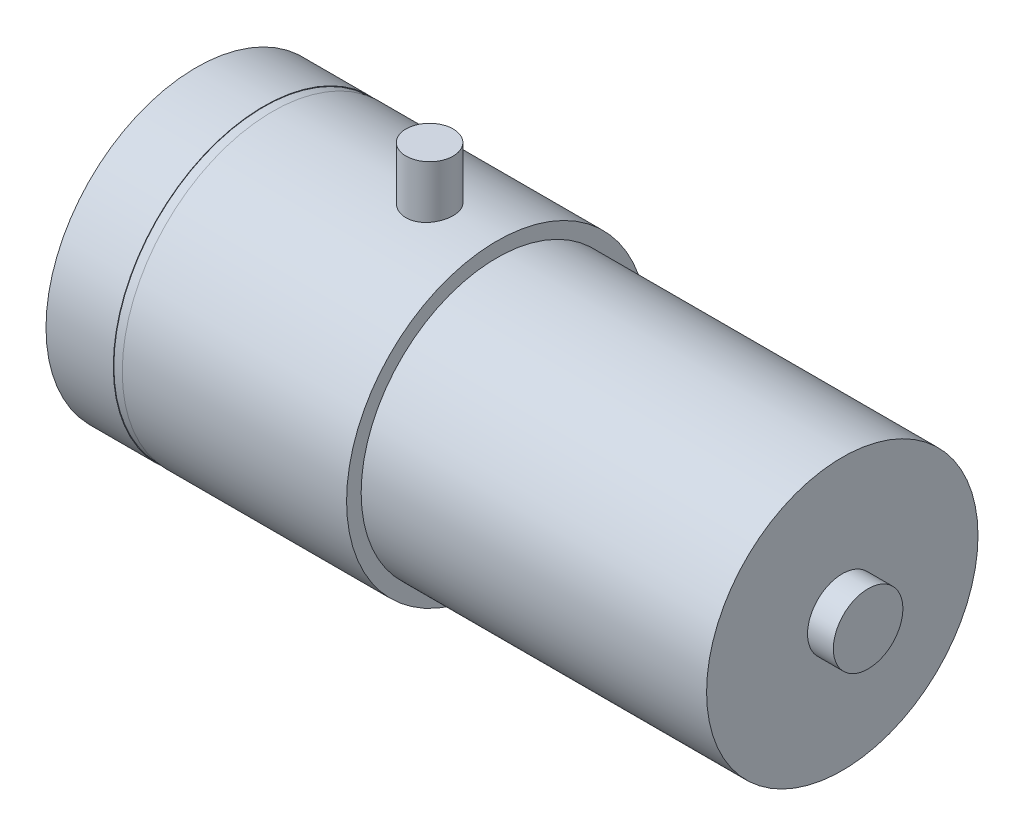
ISO-10303-21;
HEADER;
FILE_DESCRIPTION(('STEP AP214'),'2;1');
FILE_NAME('part.step','',(''),(''),'','','');
FILE_SCHEMA(('AUTOMOTIVE_DESIGN { 1 0 10303 214 1 1 1 1 }'));
ENDSEC;
DATA;
#1=APPLICATION_CONTEXT('core data for automotive mechanical design processes');
#2=APPLICATION_PROTOCOL_DEFINITION('international standard','automotive_design',2000,#1);
#3=PRODUCT_CONTEXT('',#1,'mechanical');
#4=PRODUCT('Part','Part','',(#3));
#5=PRODUCT_RELATED_PRODUCT_CATEGORY('part','',(#4));
#6=PRODUCT_DEFINITION_FORMATION('','',#4);
#7=PRODUCT_DEFINITION_CONTEXT('part definition',#1,'design');
#8=PRODUCT_DEFINITION('design','',#6,#7);
#9=PRODUCT_DEFINITION_SHAPE('','',#8);
#10=(LENGTH_UNIT() NAMED_UNIT(*) SI_UNIT(.MILLI.,.METRE.));
#11=(NAMED_UNIT(*) PLANE_ANGLE_UNIT() SI_UNIT($,.RADIAN.));
#12=(NAMED_UNIT(*) SI_UNIT($,.STERADIAN.) SOLID_ANGLE_UNIT());
#13=UNCERTAINTY_MEASURE_WITH_UNIT(LENGTH_MEASURE(1.E-05),#10,'distance_accuracy_value','');
#14=(GEOMETRIC_REPRESENTATION_CONTEXT(3) GLOBAL_UNCERTAINTY_ASSIGNED_CONTEXT((#13)) GLOBAL_UNIT_ASSIGNED_CONTEXT((#10,
#11,#12)) REPRESENTATION_CONTEXT('',''));
#15=CARTESIAN_POINT('',(0.,0.,0.));
#16=DIRECTION('',(0.,0.,1.));
#17=DIRECTION('',(1.,0.,0.));
#18=AXIS2_PLACEMENT_3D('',#15,#16,#17);
#19=CARTESIAN_POINT('',(0.,0.,0.));
#20=DIRECTION('',(-1.,0.,0.));
#21=DIRECTION('',(0.,0.,1.));
#22=AXIS2_PLACEMENT_3D('',#19,#20,#21);
#23=CYLINDRICAL_SURFACE('',#22,13.4);
#24=CARTESIAN_POINT('',(0.,0.,0.));
#25=DIRECTION('',(-1.,0.,0.));
#26=DIRECTION('',(0.,0.,1.));
#27=AXIS2_PLACEMENT_3D('',#24,#25,#26);
#28=CIRCLE('',#27,13.4);
#29=CARTESIAN_POINT('',(0.,0.,13.4));
#30=VERTEX_POINT('',#29);
#31=EDGE_CURVE('E62',#30,#30,#28,.T.);
#32=ORIENTED_EDGE('',*,*,#31,.T.);
#33=EDGE_LOOP('',(#32));
#34=FACE_BOUND('',#33,.T.);
#35=CARTESIAN_POINT('',(-6.,13.2344248080527,-2.1));
#36=CARTESIAN_POINT('',(-6.11717818746653,13.2344268329379,-2.09999520883422));
#37=CARTESIAN_POINT('',(-6.2344228233307,13.2359979091316,-2.09015915275951));
#38=CARTESIAN_POINT('',(-6.46562951634947,13.2421076350988,-2.05108785263193));
#39=CARTESIAN_POINT('',(-6.57958833147715,13.2466491176703,-2.02183409003078));
#40=CARTESIAN_POINT('',(-6.80084348960755,13.2581729344237,-1.94482798306534));
#41=CARTESIAN_POINT('',(-6.90814504489792,13.2651533299239,-1.89709032821826));
#42=CARTESIAN_POINT('',(-7.11320144390801,13.2807661612917,-1.78450692997691));
#43=CARTESIAN_POINT('',(-7.21095750565998,13.2893983859641,-1.71966337326356));
#44=CARTESIAN_POINT('',(-7.39501500473531,13.3074264620158,-1.57410469586371));
#45=CARTESIAN_POINT('',(-7.48122103943449,13.3168277497834,-1.49326959719594));
#46=CARTESIAN_POINT('',(-7.63890392091635,13.3352862334482,-1.31828161732963));
#47=CARTESIAN_POINT('',(-7.71037993359709,13.344343409836,-1.22412798246474));
#48=CARTESIAN_POINT('',(-7.83692826781281,13.3611503175073,-1.02456161168595));
#49=CARTESIAN_POINT('',(-7.89191235989812,13.3688929236176,-0.919092276781868));
#50=CARTESIAN_POINT('',(-7.98334950594514,13.3821379823728,-0.700273485294438));
#51=CARTESIAN_POINT('',(-8.01980362695284,13.3876405640054,-0.586924482888115));
#52=CARTESIAN_POINT('',(-8.07285578735806,13.395747218984,-0.356547754062227));
#53=CARTESIAN_POINT('',(-8.08961380989324,13.3983746338818,-0.239557703950515));
#54=CARTESIAN_POINT('',(-8.10329511537548,13.4005149934146,-0.00439873601064053));
#55=CARTESIAN_POINT('',(-8.10021959698247,13.4000281262643,0.113770110144837));
#56=CARTESIAN_POINT('',(-8.07444679424949,13.3960133607905,0.346839873484643));
#57=CARTESIAN_POINT('',(-8.05192164833424,13.3925121417018,0.461760350691524));
#58=CARTESIAN_POINT('',(-7.98815953282617,13.3828917946048,0.686169982430935));
#59=CARTESIAN_POINT('',(-7.94692204632912,13.3767725942783,0.795658986833356));
#60=CARTESIAN_POINT('',(-7.84673162491001,13.3625581421093,1.00661514799387));
#61=CARTESIAN_POINT('',(-7.78770682470212,13.3544548996147,1.10804761308435));
#62=CARTESIAN_POINT('',(-7.6536698115848,13.3371743717333,1.29963318957982));
#63=CARTESIAN_POINT('',(-7.57865645162549,13.3279970093084,1.38978549098744));
#64=CARTESIAN_POINT('',(-7.41381435454068,13.3094743628386,1.55726727804288));
#65=CARTESIAN_POINT('',(-7.32383526062865,13.3001283336644,1.63444876823077));
#66=CARTESIAN_POINT('',(-7.1321250509749,13.2824174635806,1.77264074451014));
#67=CARTESIAN_POINT('',(-7.03039384972543,13.274052629811,1.83365111293068));
#68=CARTESIAN_POINT('',(-6.81790616205338,13.2592512155886,1.93779251985929));
#69=CARTESIAN_POINT('',(-6.70714159205383,13.2528163868394,1.98090732961048));
#70=CARTESIAN_POINT('',(-6.47981963319067,13.242633731551,2.04787946670325));
#71=CARTESIAN_POINT('',(-6.36326269277882,13.2388856973427,2.07173828240718));
#72=CARTESIAN_POINT('',(-6.12898425504775,13.2345407046387,2.09931608061901));
#73=CARTESIAN_POINT('',(-6.01128809675754,13.2339108517996,2.1032453153106));
#74=CARTESIAN_POINT('',(-5.7769187730123,13.2357860932734,2.0914112463213));
#75=CARTESIAN_POINT('',(-5.66024557293251,13.2382910810635,2.07564861177589));
#76=CARTESIAN_POINT('',(-5.43189189790453,13.2461234696255,2.02505694059599));
#77=CARTESIAN_POINT('',(-5.32018743579396,13.2514352278888,1.99033353939515));
#78=CARTESIAN_POINT('',(-5.10418375594274,13.2642696685925,1.90291624179942));
#79=CARTESIAN_POINT('',(-4.99988493482286,13.2717924693381,1.85022138379064));
#80=CARTESIAN_POINT('',(-4.80071333531679,13.2882784469409,1.72785532619684));
#81=CARTESIAN_POINT('',(-4.70592479845636,13.2972529213526,1.65804855797289));
#82=CARTESIAN_POINT('',(-4.52933238414812,13.315597411741,1.5036277622499));
#83=CARTESIAN_POINT('',(-4.44752931111378,13.3249674521766,1.41901281810754));
#84=CARTESIAN_POINT('',(-4.29846987817763,13.3431506020545,1.23644944734625));
#85=CARTESIAN_POINT('',(-4.2313532013652,13.3519578432653,1.13838630050789));
#86=CARTESIAN_POINT('',(-4.11454697785279,13.3679307325765,0.932254783756008));
#87=CARTESIAN_POINT('',(-4.06485691946187,13.375096428875,0.824186707731075));
#88=CARTESIAN_POINT('',(-3.98453537097818,13.3869532184823,0.601540810020855));
#89=CARTESIAN_POINT('',(-3.95382879252081,13.3916540501017,0.486990617800123));
#90=CARTESIAN_POINT('',(-3.91210329994068,13.3980924486243,0.254280274777901));
#91=CARTESIAN_POINT('',(-3.90108296108491,13.3998302299691,0.136120385847038));
#92=CARTESIAN_POINT('',(-3.89907998361477,13.400144233781,-0.0991030480750314));
#93=CARTESIAN_POINT('',(-3.90788409134627,13.3987541036381,-0.21616478771733));
#94=CARTESIAN_POINT('',(-3.94482136676103,13.3930366543114,-0.447120959748243));
#95=CARTESIAN_POINT('',(-3.97295445539946,13.388709347139,-0.561015405087356));
#96=CARTESIAN_POINT('',(-4.04767298914939,13.3776016784268,-0.782336400210707));
#97=CARTESIAN_POINT('',(-4.0942423438408,13.3708234563911,-0.889768496135682));
#98=CARTESIAN_POINT('',(-4.20448836686199,13.3555566643409,-1.09532738271834));
#99=CARTESIAN_POINT('',(-4.26816569188449,13.347068028675,-1.19345381598071));
#100=CARTESIAN_POINT('',(-4.41158535577627,13.3292145621201,-1.37869476159619));
#101=CARTESIAN_POINT('',(-4.49148466450651,13.3198416899731,-1.46568697968396));
#102=CARTESIAN_POINT('',(-4.66475010039897,13.3013341052644,-1.62510568366802));
#103=CARTESIAN_POINT('',(-4.7581193797974,13.2921994490424,-1.6975287505728));
#104=CARTESIAN_POINT('',(-4.95635537267851,13.2751418821089,-1.82615893667389));
#105=CARTESIAN_POINT('',(-5.06128953541595,13.2672268038787,-1.88226313963687));
#106=CARTESIAN_POINT('',(-5.27916937095758,13.2535966477741,-1.97596487373444));
#107=CARTESIAN_POINT('',(-5.39210671453513,13.2478793213086,-2.01358133132003));
#108=CARTESIAN_POINT('',(-5.58793802504824,13.240592330334,-2.06084572104388));
#109=CARTESIAN_POINT('',(-5.669631392331,13.2382920033536,-2.07550568795052));
#110=CARTESIAN_POINT('',(-5.83420542836881,13.2352075370932,-2.0950844500892));
#111=CARTESIAN_POINT('',(-5.91708607945016,13.2344233752675,-2.1000033901731));
#112=CARTESIAN_POINT('',(-6.,13.2344248080527,-2.1));
#113=B_SPLINE_CURVE_WITH_KNOTS('',3,(#35,#36,#37,#38,#39,#40,#41,#42,#43,#44,#45,#46,#47,#48,
#49,#50,#51,#52,#53,#54,#55,#56,#57,#58,#59,#60,#61,#62,#63,#64,#65,#66,#67,#68,#69,#70,#71,#72,
#73,#74,#75,#76,#77,#78,#79,#80,#81,#82,#83,#84,#85,#86,#87,#88,#89,#90,#91,#92,#93,#94,#95,#96,
#97,#98,#99,#100,#101,#102,#103,#104,#105,#106,#107,#108,#109,#110,#111,#112),.UNSPECIFIED.,.T.,
.F.,(4,2,2,2,2,2,2,2,2,2,2,2,2,2,2,2,2,2,2,2,2,2,2,2,2,2,2,2,2,2,2,2,2,2,2,2,2,2,4),(0.,
0.351231448549968,0.702798346593373,1.05408641899315,1.40532960729313,1.75931544396376,
2.11332131992495,2.46918861605446,2.82503541728947,3.17797139865939,3.53088605018915,
3.88070888692131,4.23054138764564,4.58180669477831,4.93309721084381,5.28815772044631,
5.64322081361437,5.99860519929505,6.35396211345663,6.70556218527668,7.05715030994853,
7.40679933836232,7.75646707867739,8.10900005103615,8.46155485331997,8.81732964028214,
9.17309397989434,9.52744195094444,9.88176427607539,10.2322933486177,10.5828209876986,
10.9330433726292,11.2832792028343,11.6370810753816,11.9909658791908,12.3470363605311,
12.7027415587597,12.9512725363346,13.1997998181549),.UNSPECIFIED.);
#114=CARTESIAN_POINT('',(-6.,13.2344248080527,-2.1));
#115=VERTEX_POINT('',#114);
#116=EDGE_CURVE('E10',#115,#115,#113,.T.);
#117=ORIENTED_EDGE('',*,*,#116,.F.);
#118=EDGE_LOOP('',(#117));
#119=FACE_BOUND('',#118,.T.);
#120=CARTESIAN_POINT('',(-20.,0.,0.));
#121=DIRECTION('',(-1.,0.,0.));
#122=DIRECTION('',(0.,0.,1.));
#123=AXIS2_PLACEMENT_3D('',#120,#121,#122);
#124=CIRCLE('',#123,13.4);
#125=CARTESIAN_POINT('',(-20.,0.,13.4));
#126=VERTEX_POINT('',#125);
#127=EDGE_CURVE('E80',#126,#126,#124,.T.);
#128=ORIENTED_EDGE('',*,*,#127,.F.);
#129=EDGE_LOOP('',(#128));
#130=FACE_BOUND('',#129,.T.);
#131=ADVANCED_FACE('F37',(#34,#119,#130),#23,.T.);
#132=CARTESIAN_POINT('',(0.,13.4,0.));
#133=DIRECTION('',(-1.,0.,0.));
#134=DIRECTION('',(0.,0.,1.));
#135=AXIS2_PLACEMENT_3D('',#132,#133,#134);
#136=PLANE('',#135);
#137=ORIENTED_EDGE('',*,*,#31,.F.);
#138=EDGE_LOOP('',(#137));
#139=FACE_BOUND('',#138,.T.);
#140=CARTESIAN_POINT('',(0.,0.,0.));
#141=DIRECTION('',(-1.,0.,0.));
#142=DIRECTION('',(0.,0.,1.));
#143=AXIS2_PLACEMENT_3D('',#140,#141,#142);
#144=CIRCLE('',#143,12.1);
#145=CARTESIAN_POINT('',(0.,0.,12.1));
#146=VERTEX_POINT('',#145);
#147=EDGE_CURVE('E65',#146,#146,#144,.T.);
#148=ORIENTED_EDGE('',*,*,#147,.T.);
#149=EDGE_LOOP('',(#148));
#150=FACE_BOUND('',#149,.T.);
#151=ADVANCED_FACE('F105',(#139,#150),#136,.F.);
#152=CARTESIAN_POINT('',(0.,0.,0.));
#153=DIRECTION('',(-1.,0.,0.));
#154=DIRECTION('',(0.,0.,1.));
#155=AXIS2_PLACEMENT_3D('',#152,#153,#154);
#156=CYLINDRICAL_SURFACE('',#155,12.1);
#157=ORIENTED_EDGE('',*,*,#147,.F.);
#158=EDGE_LOOP('',(#157));
#159=FACE_BOUND('',#158,.T.);
#160=CARTESIAN_POINT('',(30.8,0.,0.));
#161=DIRECTION('',(-1.,0.,0.));
#162=DIRECTION('',(0.,0.,1.));
#163=AXIS2_PLACEMENT_3D('',#160,#161,#162);
#164=CIRCLE('',#163,12.1);
#165=CARTESIAN_POINT('',(30.8,0.,12.1));
#166=VERTEX_POINT('',#165);
#167=EDGE_CURVE('E68',#166,#166,#164,.T.);
#168=ORIENTED_EDGE('',*,*,#167,.T.);
#169=EDGE_LOOP('',(#168));
#170=FACE_BOUND('',#169,.T.);
#171=ADVANCED_FACE('F111',(#159,#170),#156,.T.);
#172=CARTESIAN_POINT('',(30.8,12.1,0.));
#173=DIRECTION('',(-1.,0.,0.));
#174=DIRECTION('',(0.,0.,1.));
#175=AXIS2_PLACEMENT_3D('',#172,#173,#174);
#176=PLANE('',#175);
#177=ORIENTED_EDGE('',*,*,#167,.F.);
#178=EDGE_LOOP('',(#177));
#179=FACE_BOUND('',#178,.T.);
#180=CARTESIAN_POINT('',(30.8,0.,0.));
#181=DIRECTION('',(-1.,0.,0.));
#182=DIRECTION('',(0.,0.,1.));
#183=AXIS2_PLACEMENT_3D('',#180,#181,#182);
#184=CIRCLE('',#183,3.1);
#185=CARTESIAN_POINT('',(30.8,0.,3.1));
#186=VERTEX_POINT('',#185);
#187=EDGE_CURVE('E71',#186,#186,#184,.T.);
#188=ORIENTED_EDGE('',*,*,#187,.T.);
#189=EDGE_LOOP('',(#188));
#190=FACE_BOUND('',#189,.T.);
#191=ADVANCED_FACE('F152',(#179,#190),#176,.F.);
#192=CARTESIAN_POINT('',(0.,0.,0.));
#193=DIRECTION('',(-1.,0.,0.));
#194=DIRECTION('',(0.,0.,1.));
#195=AXIS2_PLACEMENT_3D('',#192,#193,#194);
#196=CYLINDRICAL_SURFACE('',#195,3.1);
#197=ORIENTED_EDGE('',*,*,#187,.F.);
#198=EDGE_LOOP('',(#197));
#199=FACE_BOUND('',#198,.T.);
#200=CARTESIAN_POINT('',(33.1,0.,0.));
#201=DIRECTION('',(-1.,0.,0.));
#202=DIRECTION('',(0.,0.,1.));
#203=AXIS2_PLACEMENT_3D('',#200,#201,#202);
#204=CIRCLE('',#203,3.1);
#205=CARTESIAN_POINT('',(33.1,0.,3.1));
#206=VERTEX_POINT('',#205);
#207=EDGE_CURVE('E74',#206,#206,#204,.T.);
#208=ORIENTED_EDGE('',*,*,#207,.T.);
#209=EDGE_LOOP('',(#208));
#210=FACE_BOUND('',#209,.T.);
#211=ADVANCED_FACE('F148',(#199,#210),#196,.T.);
#212=CARTESIAN_POINT('',(33.1,3.1,0.));
#213=DIRECTION('',(-1.,0.,0.));
#214=DIRECTION('',(0.,0.,1.));
#215=AXIS2_PLACEMENT_3D('',#212,#213,#214);
#216=PLANE('',#215);
#217=ORIENTED_EDGE('',*,*,#207,.F.);
#218=EDGE_LOOP('',(#217));
#219=FACE_BOUND('',#218,.T.);
#220=ADVANCED_FACE('F144',(#219),#216,.F.);
#221=CARTESIAN_POINT('',(-6.,18.,0.));
#222=DIRECTION('',(0.,-1.,0.));
#223=DIRECTION('',(0.,0.,-1.));
#224=AXIS2_PLACEMENT_3D('',#221,#222,#223);
#225=CYLINDRICAL_SURFACE('',#224,2.1);
#226=CARTESIAN_POINT('',(-6.,18.,0.));
#227=DIRECTION('',(0.,1.,0.));
#228=DIRECTION('',(0.,0.,1.));
#229=AXIS2_PLACEMENT_3D('',#226,#227,#228);
#230=CIRCLE('',#229,2.1);
#231=CARTESIAN_POINT('',(-6.,18.,2.1));
#232=VERTEX_POINT('',#231);
#233=EDGE_CURVE('E77',#232,#232,#230,.T.);
#234=ORIENTED_EDGE('',*,*,#233,.F.);
#235=EDGE_LOOP('',(#234));
#236=FACE_BOUND('',#235,.T.);
#237=ORIENTED_EDGE('',*,*,#116,.T.);
#238=EDGE_LOOP('',(#237));
#239=FACE_BOUND('',#238,.T.);
#240=ADVANCED_FACE('F139',(#236,#239),#225,.T.);
#241=CARTESIAN_POINT('',(-6.,18.,0.));
#242=DIRECTION('',(0.,1.,0.));
#243=DIRECTION('',(0.,0.,1.));
#244=AXIS2_PLACEMENT_3D('',#241,#242,#243);
#245=PLANE('',#244);
#246=ORIENTED_EDGE('',*,*,#233,.T.);
#247=EDGE_LOOP('',(#246));
#248=FACE_BOUND('',#247,.T.);
#249=ADVANCED_FACE('F100',(#248),#245,.T.);
#250=CARTESIAN_POINT('',(-20.,0.,0.));
#251=DIRECTION('',(-1.,0.,0.));
#252=DIRECTION('',(0.,0.,1.));
#253=AXIS2_PLACEMENT_3D('',#250,#251,#252);
#254=PLANE('',#253);
#255=CARTESIAN_POINT('',(-20.,0.,0.));
#256=DIRECTION('',(-1.,0.,0.));
#257=DIRECTION('',(0.,0.,1.));
#258=AXIS2_PLACEMENT_3D('',#255,#256,#257);
#259=CIRCLE('',#258,13.35);
#260=CARTESIAN_POINT('',(-20.,0.,13.35));
#261=VERTEX_POINT('',#260);
#262=EDGE_CURVE('E84',#261,#261,#259,.T.);
#263=ORIENTED_EDGE('',*,*,#262,.F.);
#264=EDGE_LOOP('',(#263));
#265=FACE_BOUND('',#264,.T.);
#266=ORIENTED_EDGE('',*,*,#127,.T.);
#267=EDGE_LOOP('',(#266));
#268=FACE_BOUND('',#267,.T.);
#269=ADVANCED_FACE('F96',(#265,#268),#254,.T.);
#270=CARTESIAN_POINT('',(-20.8,0.,0.));
#271=DIRECTION('',(-1.,0.,0.));
#272=DIRECTION('',(0.,0.,1.));
#273=AXIS2_PLACEMENT_3D('',#270,#271,#272);
#274=PLANE('',#273);
#275=CARTESIAN_POINT('',(-20.8,0.,0.));
#276=DIRECTION('',(-1.,0.,0.));
#277=DIRECTION('',(0.,0.,1.));
#278=AXIS2_PLACEMENT_3D('',#275,#276,#277);
#279=CIRCLE('',#278,13.35);
#280=CARTESIAN_POINT('',(-20.8,0.,13.35));
#281=VERTEX_POINT('',#280);
#282=EDGE_CURVE('E87',#281,#281,#279,.T.);
#283=ORIENTED_EDGE('',*,*,#282,.T.);
#284=EDGE_LOOP('',(#283));
#285=FACE_BOUND('',#284,.T.);
#286=CARTESIAN_POINT('',(-20.8,0.,0.));
#287=DIRECTION('',(-1.,0.,0.));
#288=DIRECTION('',(0.,0.,1.));
#289=AXIS2_PLACEMENT_3D('',#286,#287,#288);
#290=CIRCLE('',#289,13.4);
#291=CARTESIAN_POINT('',(-20.8,0.,13.4));
#292=VERTEX_POINT('',#291);
#293=EDGE_CURVE('E81',#292,#292,#290,.T.);
#294=ORIENTED_EDGE('',*,*,#293,.F.);
#295=EDGE_LOOP('',(#294));
#296=FACE_BOUND('',#295,.T.);
#297=ADVANCED_FACE('F99',(#285,#296),#274,.F.);
#298=CARTESIAN_POINT('',(-20.,0.,0.));
#299=DIRECTION('',(-1.,0.,0.));
#300=DIRECTION('',(0.,0.,1.));
#301=AXIS2_PLACEMENT_3D('',#298,#299,#300);
#302=CYLINDRICAL_SURFACE('',#301,13.35);
#303=ORIENTED_EDGE('',*,*,#262,.T.);
#304=EDGE_LOOP('',(#303));
#305=FACE_BOUND('',#304,.T.);
#306=ORIENTED_EDGE('',*,*,#282,.F.);
#307=EDGE_LOOP('',(#306));
#308=FACE_BOUND('',#307,.T.);
#309=ADVANCED_FACE('F93',(#305,#308),#302,.T.);
#310=CARTESIAN_POINT('',(-33.6,0.,0.));
#311=DIRECTION('',(1.,0.,0.));
#312=DIRECTION('',(0.,0.,-1.));
#313=AXIS2_PLACEMENT_3D('',#310,#311,#312);
#314=PLANE('',#313);
#315=CARTESIAN_POINT('',(-33.6,0.,0.));
#316=DIRECTION('',(-1.,0.,0.));
#317=DIRECTION('',(0.,0.,1.));
#318=AXIS2_PLACEMENT_3D('',#315,#316,#317);
#319=CIRCLE('',#318,2.15);
#320=CARTESIAN_POINT('',(-33.6,0.,2.15));
#321=VERTEX_POINT('',#320);
#322=EDGE_CURVE('E49',#321,#321,#319,.T.);
#323=ORIENTED_EDGE('',*,*,#322,.T.);
#324=EDGE_LOOP('',(#323));
#325=FACE_BOUND('',#324,.T.);
#326=ADVANCED_FACE('F39',(#325),#314,.F.);
#327=CARTESIAN_POINT('',(0.,0.,0.));
#328=DIRECTION('',(-1.,0.,0.));
#329=DIRECTION('',(0.,0.,1.));
#330=AXIS2_PLACEMENT_3D('',#327,#328,#329);
#331=CYLINDRICAL_SURFACE('',#330,2.15);
#332=ORIENTED_EDGE('',*,*,#322,.F.);
#333=EDGE_LOOP('',(#332));
#334=FACE_BOUND('',#333,.T.);
#335=CARTESIAN_POINT('',(-26.8,0.,0.));
#336=DIRECTION('',(-1.,0.,0.));
#337=DIRECTION('',(0.,0.,1.));
#338=AXIS2_PLACEMENT_3D('',#335,#336,#337);
#339=CIRCLE('',#338,2.15);
#340=CARTESIAN_POINT('',(-26.8,0.,2.15));
#341=VERTEX_POINT('',#340);
#342=EDGE_CURVE('E53',#341,#341,#339,.T.);
#343=ORIENTED_EDGE('',*,*,#342,.T.);
#344=EDGE_LOOP('',(#343));
#345=FACE_BOUND('',#344,.T.);
#346=ADVANCED_FACE('F123',(#334,#345),#331,.T.);
#347=CARTESIAN_POINT('',(-26.8,2.15,0.));
#348=DIRECTION('',(1.,0.,0.));
#349=DIRECTION('',(0.,0.,-1.));
#350=AXIS2_PLACEMENT_3D('',#347,#348,#349);
#351=PLANE('',#350);
#352=ORIENTED_EDGE('',*,*,#342,.F.);
#353=EDGE_LOOP('',(#352));
#354=FACE_BOUND('',#353,.T.);
#355=CARTESIAN_POINT('',(-26.8,0.,0.));
#356=DIRECTION('',(-1.,0.,0.));
#357=DIRECTION('',(0.,0.,1.));
#358=AXIS2_PLACEMENT_3D('',#355,#356,#357);
#359=CIRCLE('',#358,13.4);
#360=CARTESIAN_POINT('',(-26.8,0.,13.4));
#361=VERTEX_POINT('',#360);
#362=EDGE_CURVE('E57',#361,#361,#359,.T.);
#363=ORIENTED_EDGE('',*,*,#362,.T.);
#364=EDGE_LOOP('',(#363));
#365=FACE_BOUND('',#364,.T.);
#366=ADVANCED_FACE('F118',(#354,#365),#351,.F.);
#367=ORIENTED_EDGE('',*,*,#293,.T.);
#368=EDGE_LOOP('',(#367));
#369=FACE_BOUND('',#368,.T.);
#370=ORIENTED_EDGE('',*,*,#362,.F.);
#371=EDGE_LOOP('',(#370));
#372=FACE_BOUND('',#371,.T.);
#373=ADVANCED_FACE('F107',(#369,#372),#23,.T.);
#374=CLOSED_SHELL('',(#131,#151,#171,#191,#211,#220,#240,#249,#269,#297,#309,#326,#346,#366,#373));
#375=MANIFOLD_SOLID_BREP('B2',#374);
#376=ADVANCED_BREP_SHAPE_REPRESENTATION('',(#18,#375),#14);
#377=SHAPE_DEFINITION_REPRESENTATION(#9,#376);
ENDSEC;
END-ISO-10303-21;
